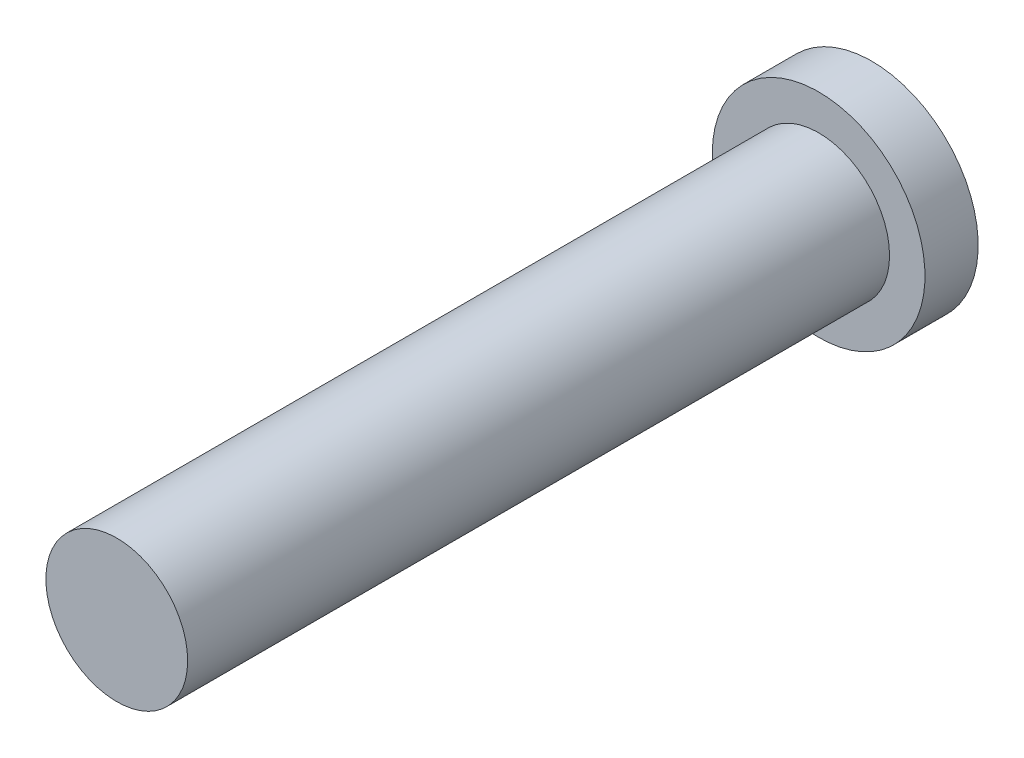
ISO-10303-21;
HEADER;
FILE_DESCRIPTION(('STEP AP214'),'2;1');
FILE_NAME('part.step','',(''),(''),'','','');
FILE_SCHEMA(('AUTOMOTIVE_DESIGN { 1 0 10303 214 1 1 1 1 }'));
ENDSEC;
DATA;
#1=APPLICATION_CONTEXT('core data for automotive mechanical design processes');
#2=APPLICATION_PROTOCOL_DEFINITION('international standard','automotive_design',2000,#1);
#3=PRODUCT_CONTEXT('',#1,'mechanical');
#4=PRODUCT('Part','Part','',(#3));
#5=PRODUCT_RELATED_PRODUCT_CATEGORY('part','',(#4));
#6=PRODUCT_DEFINITION_FORMATION('','',#4);
#7=PRODUCT_DEFINITION_CONTEXT('part definition',#1,'design');
#8=PRODUCT_DEFINITION('design','',#6,#7);
#9=PRODUCT_DEFINITION_SHAPE('','',#8);
#10=(LENGTH_UNIT() NAMED_UNIT(*) SI_UNIT(.MILLI.,.METRE.));
#11=(NAMED_UNIT(*) PLANE_ANGLE_UNIT() SI_UNIT($,.RADIAN.));
#12=(NAMED_UNIT(*) SI_UNIT($,.STERADIAN.) SOLID_ANGLE_UNIT());
#13=UNCERTAINTY_MEASURE_WITH_UNIT(LENGTH_MEASURE(1.E-05),#10,'distance_accuracy_value','');
#14=(GEOMETRIC_REPRESENTATION_CONTEXT(3) GLOBAL_UNCERTAINTY_ASSIGNED_CONTEXT((#13)) GLOBAL_UNIT_ASSIGNED_CONTEXT((#10,
#11,#12)) REPRESENTATION_CONTEXT('',''));
#15=CARTESIAN_POINT('',(0.,0.,0.));
#16=DIRECTION('',(0.,0.,1.));
#17=DIRECTION('',(1.,0.,0.));
#18=AXIS2_PLACEMENT_3D('',#15,#16,#17);
#19=CARTESIAN_POINT('',(3.036,-3.036,0.));
#20=DIRECTION('',(0.,0.,-1.));
#21=DIRECTION('',(-1.,0.,0.));
#22=AXIS2_PLACEMENT_3D('',#19,#20,#21);
#23=PLANE('',#22);
#24=CARTESIAN_POINT('',(0.,0.,0.));
#25=DIRECTION('',(0.,0.,-1.));
#26=DIRECTION('',(-1.,0.,0.));
#27=AXIS2_PLACEMENT_3D('',#24,#25,#26);
#28=CIRCLE('',#27,3.);
#29=CARTESIAN_POINT('',(-3.,0.,0.));
#30=VERTEX_POINT('',#29);
#31=EDGE_CURVE('E19',#30,#30,#28,.F.);
#32=ORIENTED_EDGE('',*,*,#31,.F.);
#33=EDGE_LOOP('',(#32));
#34=FACE_BOUND('',#33,.T.);
#35=ADVANCED_FACE('F15',(#34),#23,.T.);
#36=CARTESIAN_POINT('',(0.,0.,1.65));
#37=DIRECTION('',(0.,0.,-1.));
#38=DIRECTION('',(-1.,0.,0.));
#39=AXIS2_PLACEMENT_3D('',#36,#37,#38);
#40=CYLINDRICAL_SURFACE('',#39,3.);
#41=ORIENTED_EDGE('',*,*,#31,.T.);
#42=EDGE_LOOP('',(#41));
#43=FACE_BOUND('',#42,.T.);
#44=CARTESIAN_POINT('',(0.,0.,1.5));
#45=DIRECTION('',(0.,0.,-1.));
#46=DIRECTION('',(-1.,0.,0.));
#47=AXIS2_PLACEMENT_3D('',#44,#45,#46);
#48=CIRCLE('',#47,3.);
#49=CARTESIAN_POINT('',(-3.,0.,1.5));
#50=VERTEX_POINT('',#49);
#51=EDGE_CURVE('E28',#50,#50,#48,.F.);
#52=ORIENTED_EDGE('',*,*,#51,.F.);
#53=EDGE_LOOP('',(#52));
#54=FACE_BOUND('',#53,.T.);
#55=ADVANCED_FACE('F36',(#43,#54),#40,.T.);
#56=CARTESIAN_POINT('',(-3.036,-3.036,1.5));
#57=DIRECTION('',(0.,0.,1.));
#58=DIRECTION('',(1.,0.,0.));
#59=AXIS2_PLACEMENT_3D('',#56,#57,#58);
#60=PLANE('',#59);
#61=CARTESIAN_POINT('',(0.,0.,1.5));
#62=DIRECTION('',(0.,0.,1.));
#63=DIRECTION('',(1.,0.,0.));
#64=AXIS2_PLACEMENT_3D('',#61,#62,#63);
#65=CIRCLE('',#64,2.);
#66=CARTESIAN_POINT('',(2.,0.,1.5));
#67=VERTEX_POINT('',#66);
#68=EDGE_CURVE('E23',#67,#67,#65,.T.);
#69=ORIENTED_EDGE('',*,*,#68,.F.);
#70=EDGE_LOOP('',(#69));
#71=FACE_BOUND('',#70,.T.);
#72=ORIENTED_EDGE('',*,*,#51,.T.);
#73=EDGE_LOOP('',(#72));
#74=FACE_BOUND('',#73,.T.);
#75=ADVANCED_FACE('F45',(#71,#74),#60,.T.);
#76=CARTESIAN_POINT('',(-2.024,-2.024,21.3));
#77=DIRECTION('',(0.,0.,1.));
#78=DIRECTION('',(1.,0.,0.));
#79=AXIS2_PLACEMENT_3D('',#76,#77,#78);
#80=PLANE('',#79);
#81=CARTESIAN_POINT('',(0.,0.,21.3));
#82=DIRECTION('',(0.,0.,1.));
#83=DIRECTION('',(1.,0.,0.));
#84=AXIS2_PLACEMENT_3D('',#81,#82,#83);
#85=CIRCLE('',#84,2.);
#86=CARTESIAN_POINT('',(2.,0.,21.3));
#87=VERTEX_POINT('',#86);
#88=EDGE_CURVE('E10',#87,#87,#85,.F.);
#89=ORIENTED_EDGE('',*,*,#88,.F.);
#90=EDGE_LOOP('',(#89));
#91=FACE_BOUND('',#90,.T.);
#92=ADVANCED_FACE('F48',(#91),#80,.T.);
#93=CARTESIAN_POINT('',(0.,0.,1.5));
#94=DIRECTION('',(0.,0.,1.));
#95=DIRECTION('',(1.,0.,0.));
#96=AXIS2_PLACEMENT_3D('',#93,#94,#95);
#97=CYLINDRICAL_SURFACE('',#96,2.);
#98=ORIENTED_EDGE('',*,*,#88,.T.);
#99=EDGE_LOOP('',(#98));
#100=FACE_BOUND('',#99,.T.);
#101=ORIENTED_EDGE('',*,*,#68,.T.);
#102=EDGE_LOOP('',(#101));
#103=FACE_BOUND('',#102,.T.);
#104=ADVANCED_FACE('F17',(#100,#103),#97,.T.);
#105=CLOSED_SHELL('',(#35,#55,#75,#92,#104));
#106=MANIFOLD_SOLID_BREP('B1',#105);
#107=ADVANCED_BREP_SHAPE_REPRESENTATION('',(#18,#106),#14);
#108=SHAPE_DEFINITION_REPRESENTATION(#9,#107);
ENDSEC;
END-ISO-10303-21;
